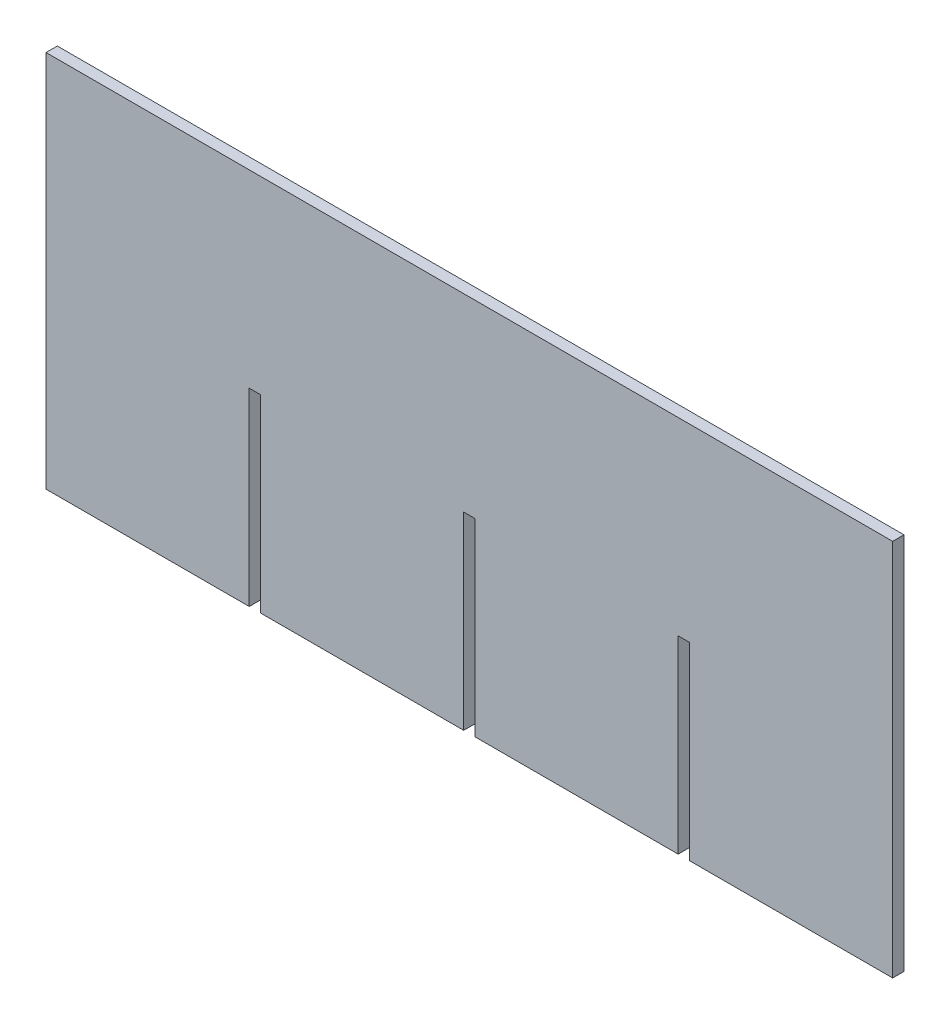
ISO-10303-21;
HEADER;
FILE_DESCRIPTION(('STEP AP214'),'2;1');
FILE_NAME('part.step','',(''),(''),'','','');
FILE_SCHEMA(('AUTOMOTIVE_DESIGN { 1 0 10303 214 1 1 1 1 }'));
ENDSEC;
DATA;
#1=APPLICATION_CONTEXT('core data for automotive mechanical design processes');
#2=APPLICATION_PROTOCOL_DEFINITION('international standard','automotive_design',2000,#1);
#3=PRODUCT_CONTEXT('',#1,'mechanical');
#4=PRODUCT('Part','Part','',(#3));
#5=PRODUCT_RELATED_PRODUCT_CATEGORY('part','',(#4));
#6=PRODUCT_DEFINITION_FORMATION('','',#4);
#7=PRODUCT_DEFINITION_CONTEXT('part definition',#1,'design');
#8=PRODUCT_DEFINITION('design','',#6,#7);
#9=PRODUCT_DEFINITION_SHAPE('','',#8);
#10=(LENGTH_UNIT() NAMED_UNIT(*) SI_UNIT(.MILLI.,.METRE.));
#11=(NAMED_UNIT(*) PLANE_ANGLE_UNIT() SI_UNIT($,.RADIAN.));
#12=(NAMED_UNIT(*) SI_UNIT($,.STERADIAN.) SOLID_ANGLE_UNIT());
#13=UNCERTAINTY_MEASURE_WITH_UNIT(LENGTH_MEASURE(1.E-05),#10,'distance_accuracy_value','');
#14=(GEOMETRIC_REPRESENTATION_CONTEXT(3) GLOBAL_UNCERTAINTY_ASSIGNED_CONTEXT((#13)) GLOBAL_UNIT_ASSIGNED_CONTEXT((#10,
#11,#12)) REPRESENTATION_CONTEXT('',''));
#15=CARTESIAN_POINT('',(0.,0.,0.));
#16=DIRECTION('',(0.,0.,1.));
#17=DIRECTION('',(1.,0.,0.));
#18=AXIS2_PLACEMENT_3D('',#15,#16,#17);
#19=CARTESIAN_POINT('',(75.,-33.5,2.));
#20=DIRECTION('',(0.,1.,0.));
#21=DIRECTION('',(-1.,0.,0.));
#22=AXIS2_PLACEMENT_3D('',#19,#20,#21);
#23=PLANE('',#22);
#24=DIRECTION('',(0.,0.,1.));
#25=VECTOR('',#24,1.);
#26=CARTESIAN_POINT('',(-0.999999999999966,-33.5,0.));
#27=LINE('',#26,#25);
#28=CARTESIAN_POINT('',(-0.999999999999966,-33.5,0.));
#29=VERTEX_POINT('',#28);
#30=CARTESIAN_POINT('',(-0.999999999999966,-33.5,2.));
#31=VERTEX_POINT('',#30);
#32=EDGE_CURVE('E151',#29,#31,#27,.T.);
#33=ORIENTED_EDGE('',*,*,#32,.T.);
#34=DIRECTION('',(1.,0.,0.));
#35=VECTOR('',#34,1.);
#36=CARTESIAN_POINT('',(75.,-33.5,2.));
#37=LINE('',#36,#35);
#38=CARTESIAN_POINT('',(-37.,-33.5,2.));
#39=VERTEX_POINT('',#38);
#40=EDGE_CURVE('E166',#39,#31,#37,.T.);
#41=ORIENTED_EDGE('',*,*,#40,.F.);
#42=DIRECTION('',(0.,0.,1.));
#43=VECTOR('',#42,1.);
#44=CARTESIAN_POINT('',(-37.,-33.5,0.));
#45=LINE('',#44,#43);
#46=CARTESIAN_POINT('',(-37.,-33.5,0.));
#47=VERTEX_POINT('',#46);
#48=EDGE_CURVE('E277',#47,#39,#45,.T.);
#49=ORIENTED_EDGE('',*,*,#48,.F.);
#50=DIRECTION('',(1.,0.,0.));
#51=VECTOR('',#50,1.);
#52=CARTESIAN_POINT('',(75.,-33.5,0.));
#53=LINE('',#52,#51);
#54=EDGE_CURVE('E168',#47,#29,#53,.T.);
#55=ORIENTED_EDGE('',*,*,#54,.T.);
#56=EDGE_LOOP('',(#33,#41,#49,#55));
#57=FACE_BOUND('',#56,.T.);
#58=ADVANCED_FACE('F35',(#57),#23,.F.);
#59=DIRECTION('',(0.,0.,1.));
#60=VECTOR('',#59,1.);
#61=CARTESIAN_POINT('',(1.00000000000003,-33.5,0.));
#62=LINE('',#61,#60);
#63=CARTESIAN_POINT('',(1.00000000000003,-33.5,0.));
#64=VERTEX_POINT('',#63);
#65=CARTESIAN_POINT('',(1.00000000000003,-33.5,2.));
#66=VERTEX_POINT('',#65);
#67=EDGE_CURVE('E299',#64,#66,#62,.T.);
#68=ORIENTED_EDGE('',*,*,#67,.F.);
#69=CARTESIAN_POINT('',(37.,-33.5,0.));
#70=VERTEX_POINT('',#69);
#71=EDGE_CURVE('E292',#64,#70,#53,.T.);
#72=ORIENTED_EDGE('',*,*,#71,.T.);
#73=DIRECTION('',(0.,0.,1.));
#74=VECTOR('',#73,1.);
#75=CARTESIAN_POINT('',(37.,-33.5,0.));
#76=LINE('',#75,#74);
#77=CARTESIAN_POINT('',(37.,-33.5,2.));
#78=VERTEX_POINT('',#77);
#79=EDGE_CURVE('E58',#70,#78,#76,.T.);
#80=ORIENTED_EDGE('',*,*,#79,.T.);
#81=EDGE_CURVE('E177',#66,#78,#37,.T.);
#82=ORIENTED_EDGE('',*,*,#81,.F.);
#83=EDGE_LOOP('',(#68,#72,#80,#82));
#84=FACE_BOUND('',#83,.T.);
#85=ADVANCED_FACE('F297',(#84),#23,.F.);
#86=CARTESIAN_POINT('',(39.,-33.5,2.));
#87=VERTEX_POINT('',#86);
#88=CARTESIAN_POINT('',(75.,-33.5,2.));
#89=VERTEX_POINT('',#88);
#90=EDGE_CURVE('E181',#87,#89,#37,.T.);
#91=ORIENTED_EDGE('',*,*,#90,.F.);
#92=DIRECTION('',(0.,0.,1.));
#93=VECTOR('',#92,1.);
#94=CARTESIAN_POINT('',(39.,-33.5,0.));
#95=LINE('',#94,#93);
#96=CARTESIAN_POINT('',(39.,-33.5,0.));
#97=VERTEX_POINT('',#96);
#98=EDGE_CURVE('E236',#97,#87,#95,.T.);
#99=ORIENTED_EDGE('',*,*,#98,.F.);
#100=CARTESIAN_POINT('',(75.,-33.5,0.));
#101=VERTEX_POINT('',#100);
#102=EDGE_CURVE('E194',#97,#101,#53,.T.);
#103=ORIENTED_EDGE('',*,*,#102,.T.);
#104=DIRECTION('',(0.,0.,-1.));
#105=VECTOR('',#104,1.);
#106=CARTESIAN_POINT('',(75.,-33.5,2.));
#107=LINE('',#106,#105);
#108=EDGE_CURVE('E43',#89,#101,#107,.T.);
#109=ORIENTED_EDGE('',*,*,#108,.F.);
#110=EDGE_LOOP('',(#91,#99,#103,#109));
#111=FACE_BOUND('',#110,.T.);
#112=ADVANCED_FACE('F235',(#111),#23,.F.);
#113=CARTESIAN_POINT('',(0.,0.,2.));
#114=DIRECTION('',(0.,0.,1.));
#115=DIRECTION('',(1.,0.,0.));
#116=AXIS2_PLACEMENT_3D('',#113,#114,#115);
#117=PLANE('',#116);
#118=ORIENTED_EDGE('',*,*,#40,.T.);
#119=DIRECTION('',(0.,1.,0.));
#120=VECTOR('',#119,1.);
#121=CARTESIAN_POINT('',(-0.999999999999966,-33.5,2.));
#122=LINE('',#121,#120);
#123=CARTESIAN_POINT('',(-0.999999999999973,0.,2.));
#124=VERTEX_POINT('',#123);
#125=EDGE_CURVE('E148',#31,#124,#122,.T.);
#126=ORIENTED_EDGE('',*,*,#125,.T.);
#127=DIRECTION('',(1.,0.,0.));
#128=VECTOR('',#127,1.);
#129=CARTESIAN_POINT('',(-0.999999999999973,0.,2.));
#130=LINE('',#129,#128);
#131=CARTESIAN_POINT('',(1.00000000000003,0.,2.));
#132=VERTEX_POINT('',#131);
#133=EDGE_CURVE('E159',#124,#132,#130,.T.);
#134=ORIENTED_EDGE('',*,*,#133,.T.);
#135=DIRECTION('',(0.,-1.,0.));
#136=VECTOR('',#135,1.);
#137=CARTESIAN_POINT('',(1.00000000000003,0.,2.));
#138=LINE('',#137,#136);
#139=EDGE_CURVE('E270',#132,#66,#138,.T.);
#140=ORIENTED_EDGE('',*,*,#139,.T.);
#141=ORIENTED_EDGE('',*,*,#81,.T.);
#142=DIRECTION('',(0.,-1.,0.));
#143=VECTOR('',#142,1.);
#144=CARTESIAN_POINT('',(37.,0.,2.));
#145=LINE('',#144,#143);
#146=CARTESIAN_POINT('',(37.,0.,2.));
#147=VERTEX_POINT('',#146);
#148=EDGE_CURVE('E246',#147,#78,#145,.T.);
#149=ORIENTED_EDGE('',*,*,#148,.F.);
#150=DIRECTION('',(-1.,0.,0.));
#151=VECTOR('',#150,1.);
#152=CARTESIAN_POINT('',(39.,0.,2.));
#153=LINE('',#152,#151);
#154=CARTESIAN_POINT('',(39.,0.,2.));
#155=VERTEX_POINT('',#154);
#156=EDGE_CURVE('E169',#155,#147,#153,.T.);
#157=ORIENTED_EDGE('',*,*,#156,.F.);
#158=DIRECTION('',(0.,1.,0.));
#159=VECTOR('',#158,1.);
#160=CARTESIAN_POINT('',(39.,-33.5,2.));
#161=LINE('',#160,#159);
#162=EDGE_CURVE('E233',#87,#155,#161,.T.);
#163=ORIENTED_EDGE('',*,*,#162,.F.);
#164=ORIENTED_EDGE('',*,*,#90,.T.);
#165=DIRECTION('',(0.,1.,0.));
#166=VECTOR('',#165,1.);
#167=CARTESIAN_POINT('',(75.,-33.5,2.));
#168=LINE('',#167,#166);
#169=CARTESIAN_POINT('',(75.,33.5,2.));
#170=VERTEX_POINT('',#169);
#171=EDGE_CURVE('E180',#89,#170,#168,.T.);
#172=ORIENTED_EDGE('',*,*,#171,.T.);
#173=DIRECTION('',(-1.,0.,0.));
#174=VECTOR('',#173,1.);
#175=CARTESIAN_POINT('',(75.,33.5,2.));
#176=LINE('',#175,#174);
#177=CARTESIAN_POINT('',(-75.,33.5,2.));
#178=VERTEX_POINT('',#177);
#179=EDGE_CURVE('E188',#170,#178,#176,.T.);
#180=ORIENTED_EDGE('',*,*,#179,.T.);
#181=DIRECTION('',(0.,-1.,0.));
#182=VECTOR('',#181,1.);
#183=CARTESIAN_POINT('',(-75.,-33.5,2.));
#184=LINE('',#183,#182);
#185=CARTESIAN_POINT('',(-75.,-33.5,2.));
#186=VERTEX_POINT('',#185);
#187=EDGE_CURVE('E185',#178,#186,#184,.T.);
#188=ORIENTED_EDGE('',*,*,#187,.T.);
#189=CARTESIAN_POINT('',(-39.,-33.5,2.));
#190=VERTEX_POINT('',#189);
#191=EDGE_CURVE('E176',#186,#190,#37,.T.);
#192=ORIENTED_EDGE('',*,*,#191,.T.);
#193=DIRECTION('',(0.,-1.,0.));
#194=VECTOR('',#193,1.);
#195=CARTESIAN_POINT('',(-39.,0.,2.));
#196=LINE('',#195,#194);
#197=CARTESIAN_POINT('',(-39.,0.,2.));
#198=VERTEX_POINT('',#197);
#199=EDGE_CURVE('E268',#198,#190,#196,.T.);
#200=ORIENTED_EDGE('',*,*,#199,.F.);
#201=DIRECTION('',(-1.,0.,0.));
#202=VECTOR('',#201,1.);
#203=CARTESIAN_POINT('',(-37.,0.,2.));
#204=LINE('',#203,#202);
#205=CARTESIAN_POINT('',(-37.,0.,2.));
#206=VERTEX_POINT('',#205);
#207=EDGE_CURVE('E261',#206,#198,#204,.T.);
#208=ORIENTED_EDGE('',*,*,#207,.F.);
#209=DIRECTION('',(0.,1.,0.));
#210=VECTOR('',#209,1.);
#211=CARTESIAN_POINT('',(-37.,-33.5,2.));
#212=LINE('',#211,#210);
#213=EDGE_CURVE('E175',#39,#206,#212,.T.);
#214=ORIENTED_EDGE('',*,*,#213,.F.);
#215=EDGE_LOOP('',(#118,#126,#134,#140,#141,#149,#157,#163,#164,#172,#180,#188,#192,#200,#208,#214));
#216=FACE_BOUND('',#215,.T.);
#217=ADVANCED_FACE('F172',(#216),#117,.T.);
#218=CARTESIAN_POINT('',(0.,0.,0.));
#219=DIRECTION('',(0.,0.,1.));
#220=DIRECTION('',(1.,0.,0.));
#221=AXIS2_PLACEMENT_3D('',#218,#219,#220);
#222=PLANE('',#221);
#223=DIRECTION('',(0.,1.,0.));
#224=VECTOR('',#223,1.);
#225=CARTESIAN_POINT('',(-0.999999999999966,-33.5,0.));
#226=LINE('',#225,#224);
#227=CARTESIAN_POINT('',(-0.999999999999973,0.,0.));
#228=VERTEX_POINT('',#227);
#229=EDGE_CURVE('E291',#29,#228,#226,.T.);
#230=ORIENTED_EDGE('',*,*,#229,.F.);
#231=ORIENTED_EDGE('',*,*,#54,.F.);
#232=DIRECTION('',(0.,1.,0.));
#233=VECTOR('',#232,1.);
#234=CARTESIAN_POINT('',(-37.,-33.5,0.));
#235=LINE('',#234,#233);
#236=CARTESIAN_POINT('',(-37.,0.,0.));
#237=VERTEX_POINT('',#236);
#238=EDGE_CURVE('E260',#47,#237,#235,.T.);
#239=ORIENTED_EDGE('',*,*,#238,.T.);
#240=DIRECTION('',(-1.,0.,0.));
#241=VECTOR('',#240,1.);
#242=CARTESIAN_POINT('',(-37.,0.,0.));
#243=LINE('',#242,#241);
#244=CARTESIAN_POINT('',(-39.,0.,0.));
#245=VERTEX_POINT('',#244);
#246=EDGE_CURVE('E264',#237,#245,#243,.T.);
#247=ORIENTED_EDGE('',*,*,#246,.T.);
#248=DIRECTION('',(0.,-1.,0.));
#249=VECTOR('',#248,1.);
#250=CARTESIAN_POINT('',(-39.,0.,0.));
#251=LINE('',#250,#249);
#252=CARTESIAN_POINT('',(-39.,-33.5,0.));
#253=VERTEX_POINT('',#252);
#254=EDGE_CURVE('E257',#245,#253,#251,.T.);
#255=ORIENTED_EDGE('',*,*,#254,.T.);
#256=CARTESIAN_POINT('',(-75.,-33.5,0.));
#257=VERTEX_POINT('',#256);
#258=EDGE_CURVE('E196',#257,#253,#53,.T.);
#259=ORIENTED_EDGE('',*,*,#258,.F.);
#260=DIRECTION('',(0.,-1.,0.));
#261=VECTOR('',#260,1.);
#262=CARTESIAN_POINT('',(-75.,-33.5,0.));
#263=LINE('',#262,#261);
#264=CARTESIAN_POINT('',(-75.,33.5,0.));
#265=VERTEX_POINT('',#264);
#266=EDGE_CURVE('E191',#265,#257,#263,.T.);
#267=ORIENTED_EDGE('',*,*,#266,.F.);
#268=DIRECTION('',(-1.,0.,0.));
#269=VECTOR('',#268,1.);
#270=CARTESIAN_POINT('',(75.,33.5,0.));
#271=LINE('',#270,#269);
#272=CARTESIAN_POINT('',(75.,33.5,0.));
#273=VERTEX_POINT('',#272);
#274=EDGE_CURVE('E201',#273,#265,#271,.T.);
#275=ORIENTED_EDGE('',*,*,#274,.F.);
#276=DIRECTION('',(0.,1.,0.));
#277=VECTOR('',#276,1.);
#278=CARTESIAN_POINT('',(75.,-33.5,0.));
#279=LINE('',#278,#277);
#280=EDGE_CURVE('E199',#101,#273,#279,.T.);
#281=ORIENTED_EDGE('',*,*,#280,.F.);
#282=ORIENTED_EDGE('',*,*,#102,.F.);
#283=DIRECTION('',(0.,1.,0.));
#284=VECTOR('',#283,1.);
#285=CARTESIAN_POINT('',(39.,-33.5,0.));
#286=LINE('',#285,#284);
#287=CARTESIAN_POINT('',(39.,0.,0.));
#288=VERTEX_POINT('',#287);
#289=EDGE_CURVE('E251',#97,#288,#286,.T.);
#290=ORIENTED_EDGE('',*,*,#289,.T.);
#291=DIRECTION('',(-1.,0.,0.));
#292=VECTOR('',#291,1.);
#293=CARTESIAN_POINT('',(39.,0.,0.));
#294=LINE('',#293,#292);
#295=CARTESIAN_POINT('',(37.,0.,0.));
#296=VERTEX_POINT('',#295);
#297=EDGE_CURVE('E247',#288,#296,#294,.T.);
#298=ORIENTED_EDGE('',*,*,#297,.T.);
#299=DIRECTION('',(0.,-1.,0.));
#300=VECTOR('',#299,1.);
#301=CARTESIAN_POINT('',(37.,0.,0.));
#302=LINE('',#301,#300);
#303=EDGE_CURVE('E253',#296,#70,#302,.T.);
#304=ORIENTED_EDGE('',*,*,#303,.T.);
#305=ORIENTED_EDGE('',*,*,#71,.F.);
#306=DIRECTION('',(0.,-1.,0.));
#307=VECTOR('',#306,1.);
#308=CARTESIAN_POINT('',(1.00000000000003,0.,0.));
#309=LINE('',#308,#307);
#310=CARTESIAN_POINT('',(1.00000000000003,0.,0.));
#311=VERTEX_POINT('',#310);
#312=EDGE_CURVE('E160',#311,#64,#309,.T.);
#313=ORIENTED_EDGE('',*,*,#312,.F.);
#314=DIRECTION('',(1.,0.,0.));
#315=VECTOR('',#314,1.);
#316=CARTESIAN_POINT('',(-0.999999999999973,0.,0.));
#317=LINE('',#316,#315);
#318=EDGE_CURVE('E311',#228,#311,#317,.T.);
#319=ORIENTED_EDGE('',*,*,#318,.F.);
#320=EDGE_LOOP('',(#230,#231,#239,#247,#255,#259,#267,#275,#281,#282,#290,#298,#304,#305,#313,#319));
#321=FACE_BOUND('',#320,.T.);
#322=ADVANCED_FACE('F219',(#321),#222,.F.);
#323=ORIENTED_EDGE('',*,*,#258,.T.);
#324=DIRECTION('',(0.,0.,1.));
#325=VECTOR('',#324,1.);
#326=CARTESIAN_POINT('',(-39.,-33.5,0.));
#327=LINE('',#326,#325);
#328=EDGE_CURVE('E267',#253,#190,#327,.T.);
#329=ORIENTED_EDGE('',*,*,#328,.T.);
#330=ORIENTED_EDGE('',*,*,#191,.F.);
#331=DIRECTION('',(0.,0.,-1.));
#332=VECTOR('',#331,1.);
#333=CARTESIAN_POINT('',(-75.,-33.5,2.));
#334=LINE('',#333,#332);
#335=EDGE_CURVE('E11',#186,#257,#334,.T.);
#336=ORIENTED_EDGE('',*,*,#335,.T.);
#337=EDGE_LOOP('',(#323,#329,#330,#336));
#338=FACE_BOUND('',#337,.T.);
#339=ADVANCED_FACE('F280',(#338),#23,.F.);
#340=CARTESIAN_POINT('',(-75.,-33.5,2.));
#341=DIRECTION('',(1.,0.,0.));
#342=DIRECTION('',(0.,0.,-1.));
#343=AXIS2_PLACEMENT_3D('',#340,#341,#342);
#344=PLANE('',#343);
#345=ORIENTED_EDGE('',*,*,#266,.T.);
#346=ORIENTED_EDGE('',*,*,#335,.F.);
#347=ORIENTED_EDGE('',*,*,#187,.F.);
#348=DIRECTION('',(0.,0.,-1.));
#349=VECTOR('',#348,1.);
#350=CARTESIAN_POINT('',(-75.,33.5,2.));
#351=LINE('',#350,#349);
#352=EDGE_CURVE('E190',#178,#265,#351,.T.);
#353=ORIENTED_EDGE('',*,*,#352,.T.);
#354=EDGE_LOOP('',(#345,#346,#347,#353));
#355=FACE_BOUND('',#354,.T.);
#356=ADVANCED_FACE('F37',(#355),#344,.F.);
#357=CARTESIAN_POINT('',(75.,-33.5,2.));
#358=DIRECTION('',(-1.,0.,0.));
#359=DIRECTION('',(0.,0.,1.));
#360=AXIS2_PLACEMENT_3D('',#357,#358,#359);
#361=PLANE('',#360);
#362=ORIENTED_EDGE('',*,*,#280,.T.);
#363=DIRECTION('',(0.,0.,-1.));
#364=VECTOR('',#363,1.);
#365=CARTESIAN_POINT('',(75.,33.5,2.));
#366=LINE('',#365,#364);
#367=EDGE_CURVE('E205',#170,#273,#366,.T.);
#368=ORIENTED_EDGE('',*,*,#367,.F.);
#369=ORIENTED_EDGE('',*,*,#171,.F.);
#370=ORIENTED_EDGE('',*,*,#108,.T.);
#371=EDGE_LOOP('',(#362,#368,#369,#370));
#372=FACE_BOUND('',#371,.T.);
#373=ADVANCED_FACE('F212',(#372),#361,.F.);
#374=CARTESIAN_POINT('',(75.,33.5,2.));
#375=DIRECTION('',(0.,-1.,0.));
#376=DIRECTION('',(1.,0.,0.));
#377=AXIS2_PLACEMENT_3D('',#374,#375,#376);
#378=PLANE('',#377);
#379=ORIENTED_EDGE('',*,*,#274,.T.);
#380=ORIENTED_EDGE('',*,*,#352,.F.);
#381=ORIENTED_EDGE('',*,*,#179,.F.);
#382=ORIENTED_EDGE('',*,*,#367,.T.);
#383=EDGE_LOOP('',(#379,#380,#381,#382));
#384=FACE_BOUND('',#383,.T.);
#385=ADVANCED_FACE('F224',(#384),#378,.F.);
#386=CARTESIAN_POINT('',(-39.,0.,0.));
#387=DIRECTION('',(-1.,0.,0.));
#388=DIRECTION('',(0.,-1.,0.));
#389=AXIS2_PLACEMENT_3D('',#386,#387,#388);
#390=PLANE('',#389);
#391=ORIENTED_EDGE('',*,*,#199,.T.);
#392=ORIENTED_EDGE('',*,*,#328,.F.);
#393=ORIENTED_EDGE('',*,*,#254,.F.);
#394=DIRECTION('',(0.,0.,1.));
#395=VECTOR('',#394,1.);
#396=CARTESIAN_POINT('',(-39.,0.,0.));
#397=LINE('',#396,#395);
#398=EDGE_CURVE('E195',#245,#198,#397,.T.);
#399=ORIENTED_EDGE('',*,*,#398,.T.);
#400=EDGE_LOOP('',(#391,#392,#393,#399));
#401=FACE_BOUND('',#400,.T.);
#402=ADVANCED_FACE('F284',(#401),#390,.F.);
#403=CARTESIAN_POINT('',(-37.,0.,0.));
#404=DIRECTION('',(0.,1.,0.));
#405=DIRECTION('',(-1.,0.,0.));
#406=AXIS2_PLACEMENT_3D('',#403,#404,#405);
#407=PLANE('',#406);
#408=ORIENTED_EDGE('',*,*,#207,.T.);
#409=ORIENTED_EDGE('',*,*,#398,.F.);
#410=ORIENTED_EDGE('',*,*,#246,.F.);
#411=DIRECTION('',(0.,0.,1.));
#412=VECTOR('',#411,1.);
#413=CARTESIAN_POINT('',(-37.,0.,0.));
#414=LINE('',#413,#412);
#415=EDGE_CURVE('E275',#237,#206,#414,.T.);
#416=ORIENTED_EDGE('',*,*,#415,.T.);
#417=EDGE_LOOP('',(#408,#409,#410,#416));
#418=FACE_BOUND('',#417,.T.);
#419=ADVANCED_FACE('F286',(#418),#407,.F.);
#420=CARTESIAN_POINT('',(-37.,-33.5,0.));
#421=DIRECTION('',(1.,0.,0.));
#422=DIRECTION('',(0.,0.,-1.));
#423=AXIS2_PLACEMENT_3D('',#420,#421,#422);
#424=PLANE('',#423);
#425=ORIENTED_EDGE('',*,*,#213,.T.);
#426=ORIENTED_EDGE('',*,*,#415,.F.);
#427=ORIENTED_EDGE('',*,*,#238,.F.);
#428=ORIENTED_EDGE('',*,*,#48,.T.);
#429=EDGE_LOOP('',(#425,#426,#427,#428));
#430=FACE_BOUND('',#429,.T.);
#431=ADVANCED_FACE('F289',(#430),#424,.F.);
#432=CARTESIAN_POINT('',(39.,0.,0.));
#433=DIRECTION('',(0.,1.,0.));
#434=DIRECTION('',(-1.,0.,0.));
#435=AXIS2_PLACEMENT_3D('',#432,#433,#434);
#436=PLANE('',#435);
#437=ORIENTED_EDGE('',*,*,#156,.T.);
#438=DIRECTION('',(0.,0.,1.));
#439=VECTOR('',#438,1.);
#440=CARTESIAN_POINT('',(37.,0.,0.));
#441=LINE('',#440,#439);
#442=EDGE_CURVE('E240',#296,#147,#441,.T.);
#443=ORIENTED_EDGE('',*,*,#442,.F.);
#444=ORIENTED_EDGE('',*,*,#297,.F.);
#445=DIRECTION('',(0.,0.,1.));
#446=VECTOR('',#445,1.);
#447=CARTESIAN_POINT('',(39.,0.,0.));
#448=LINE('',#447,#446);
#449=EDGE_CURVE('E238',#288,#155,#448,.T.);
#450=ORIENTED_EDGE('',*,*,#449,.T.);
#451=EDGE_LOOP('',(#437,#443,#444,#450));
#452=FACE_BOUND('',#451,.T.);
#453=ADVANCED_FACE('F305',(#452),#436,.F.);
#454=CARTESIAN_POINT('',(39.,-33.5,0.));
#455=DIRECTION('',(1.,0.,0.));
#456=DIRECTION('',(0.,0.,-1.));
#457=AXIS2_PLACEMENT_3D('',#454,#455,#456);
#458=PLANE('',#457);
#459=ORIENTED_EDGE('',*,*,#162,.T.);
#460=ORIENTED_EDGE('',*,*,#449,.F.);
#461=ORIENTED_EDGE('',*,*,#289,.F.);
#462=ORIENTED_EDGE('',*,*,#98,.T.);
#463=EDGE_LOOP('',(#459,#460,#461,#462));
#464=FACE_BOUND('',#463,.T.);
#465=ADVANCED_FACE('F380',(#464),#458,.F.);
#466=CARTESIAN_POINT('',(37.,0.,0.));
#467=DIRECTION('',(-1.,0.,0.));
#468=DIRECTION('',(0.,-1.,0.));
#469=AXIS2_PLACEMENT_3D('',#466,#467,#468);
#470=PLANE('',#469);
#471=ORIENTED_EDGE('',*,*,#148,.T.);
#472=ORIENTED_EDGE('',*,*,#79,.F.);
#473=ORIENTED_EDGE('',*,*,#303,.F.);
#474=ORIENTED_EDGE('',*,*,#442,.T.);
#475=EDGE_LOOP('',(#471,#472,#473,#474));
#476=FACE_BOUND('',#475,.T.);
#477=ADVANCED_FACE('F302',(#476),#470,.F.);
#478=CARTESIAN_POINT('',(-0.999999999999966,-33.5,0.));
#479=DIRECTION('',(1.,0.,0.));
#480=DIRECTION('',(0.,1.,0.));
#481=AXIS2_PLACEMENT_3D('',#478,#479,#480);
#482=PLANE('',#481);
#483=ORIENTED_EDGE('',*,*,#125,.F.);
#484=ORIENTED_EDGE('',*,*,#32,.F.);
#485=ORIENTED_EDGE('',*,*,#229,.T.);
#486=DIRECTION('',(0.,0.,1.));
#487=VECTOR('',#486,1.);
#488=CARTESIAN_POINT('',(-0.999999999999973,0.,0.));
#489=LINE('',#488,#487);
#490=EDGE_CURVE('E154',#228,#124,#489,.T.);
#491=ORIENTED_EDGE('',*,*,#490,.T.);
#492=EDGE_LOOP('',(#483,#484,#485,#491));
#493=FACE_BOUND('',#492,.T.);
#494=ADVANCED_FACE('F150',(#493),#482,.T.);
#495=CARTESIAN_POINT('',(-0.999999999999973,0.,0.));
#496=DIRECTION('',(0.,-1.,0.));
#497=DIRECTION('',(1.,0.,0.));
#498=AXIS2_PLACEMENT_3D('',#495,#496,#497);
#499=PLANE('',#498);
#500=ORIENTED_EDGE('',*,*,#133,.F.);
#501=ORIENTED_EDGE('',*,*,#490,.F.);
#502=ORIENTED_EDGE('',*,*,#318,.T.);
#503=DIRECTION('',(0.,0.,1.));
#504=VECTOR('',#503,1.);
#505=CARTESIAN_POINT('',(1.00000000000003,0.,0.));
#506=LINE('',#505,#504);
#507=EDGE_CURVE('E50',#311,#132,#506,.T.);
#508=ORIENTED_EDGE('',*,*,#507,.T.);
#509=EDGE_LOOP('',(#500,#501,#502,#508));
#510=FACE_BOUND('',#509,.T.);
#511=ADVANCED_FACE('F318',(#510),#499,.T.);
#512=CARTESIAN_POINT('',(1.00000000000003,0.,0.));
#513=DIRECTION('',(-1.,0.,0.));
#514=DIRECTION('',(0.,0.,1.));
#515=AXIS2_PLACEMENT_3D('',#512,#513,#514);
#516=PLANE('',#515);
#517=ORIENTED_EDGE('',*,*,#139,.F.);
#518=ORIENTED_EDGE('',*,*,#507,.F.);
#519=ORIENTED_EDGE('',*,*,#312,.T.);
#520=ORIENTED_EDGE('',*,*,#67,.T.);
#521=EDGE_LOOP('',(#517,#518,#519,#520));
#522=FACE_BOUND('',#521,.T.);
#523=ADVANCED_FACE('F313',(#522),#516,.T.);
#524=CLOSED_SHELL('',(#58,#85,#112,#217,#322,#339,#356,#373,#385,#402,#419,#431,#453,#465,#477,
#494,#511,#523));
#525=MANIFOLD_SOLID_BREP('B2',#524);
#526=ADVANCED_BREP_SHAPE_REPRESENTATION('',(#18,#525),#14);
#527=SHAPE_DEFINITION_REPRESENTATION(#9,#526);
ENDSEC;
END-ISO-10303-21;
